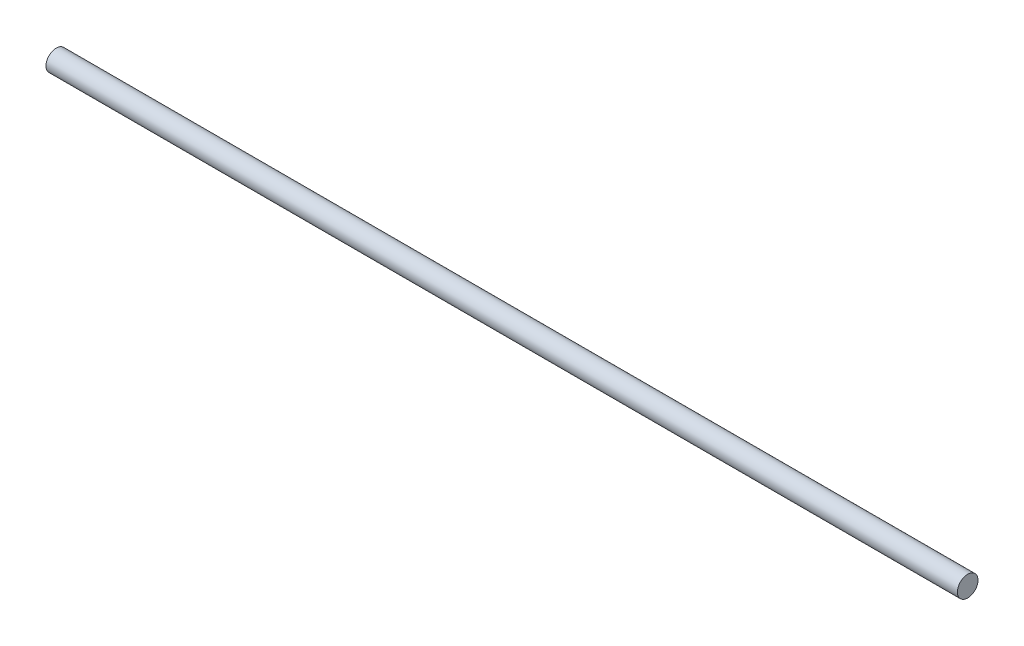
ISO-10303-21;
HEADER;
FILE_DESCRIPTION(('STEP AP214'),'2;1');
FILE_NAME('part.step','',(''),(''),'','','');
FILE_SCHEMA(('AUTOMOTIVE_DESIGN { 1 0 10303 214 1 1 1 1 }'));
ENDSEC;
DATA;
#1=APPLICATION_CONTEXT('core data for automotive mechanical design processes');
#2=APPLICATION_PROTOCOL_DEFINITION('international standard','automotive_design',2000,#1);
#3=PRODUCT_CONTEXT('',#1,'mechanical');
#4=PRODUCT('Part','Part','',(#3));
#5=PRODUCT_RELATED_PRODUCT_CATEGORY('part','',(#4));
#6=PRODUCT_DEFINITION_FORMATION('','',#4);
#7=PRODUCT_DEFINITION_CONTEXT('part definition',#1,'design');
#8=PRODUCT_DEFINITION('design','',#6,#7);
#9=PRODUCT_DEFINITION_SHAPE('','',#8);
#10=(LENGTH_UNIT() NAMED_UNIT(*) SI_UNIT(.MILLI.,.METRE.));
#11=(NAMED_UNIT(*) PLANE_ANGLE_UNIT() SI_UNIT($,.RADIAN.));
#12=(NAMED_UNIT(*) SI_UNIT($,.STERADIAN.) SOLID_ANGLE_UNIT());
#13=UNCERTAINTY_MEASURE_WITH_UNIT(LENGTH_MEASURE(1.E-05),#10,'distance_accuracy_value','');
#14=(GEOMETRIC_REPRESENTATION_CONTEXT(3) GLOBAL_UNCERTAINTY_ASSIGNED_CONTEXT((#13)) GLOBAL_UNIT_ASSIGNED_CONTEXT((#10,
#11,#12)) REPRESENTATION_CONTEXT('',''));
#15=CARTESIAN_POINT('',(0.,0.,0.));
#16=DIRECTION('',(0.,0.,1.));
#17=DIRECTION('',(1.,0.,0.));
#18=AXIS2_PLACEMENT_3D('',#15,#16,#17);
#19=CARTESIAN_POINT('',(280.747487713762,0.,0.));
#20=DIRECTION('',(-1.,0.,0.));
#21=DIRECTION('',(0.,0.,1.));
#22=AXIS2_PLACEMENT_3D('',#19,#20,#21);
#23=CYLINDRICAL_SURFACE('',#22,3.175);
#24=CARTESIAN_POINT('',(280.747487713762,0.,0.));
#25=DIRECTION('',(1.,0.,0.));
#26=DIRECTION('',(0.,0.,-1.));
#27=AXIS2_PLACEMENT_3D('',#24,#25,#26);
#28=CIRCLE('',#27,3.175);
#29=CARTESIAN_POINT('',(280.747487713762,0.,-3.175));
#30=VERTEX_POINT('',#29);
#31=EDGE_CURVE('E10',#30,#30,#28,.T.);
#32=ORIENTED_EDGE('',*,*,#31,.F.);
#33=EDGE_LOOP('',(#32));
#34=FACE_BOUND('',#33,.T.);
#35=CARTESIAN_POINT('',(0.,0.,0.));
#36=DIRECTION('',(1.,0.,0.));
#37=DIRECTION('',(0.,0.,-1.));
#38=AXIS2_PLACEMENT_3D('',#35,#36,#37);
#39=CIRCLE('',#38,3.175);
#40=CARTESIAN_POINT('',(0.,0.,-3.175));
#41=VERTEX_POINT('',#40);
#42=EDGE_CURVE('E44',#41,#41,#39,.T.);
#43=ORIENTED_EDGE('',*,*,#42,.T.);
#44=EDGE_LOOP('',(#43));
#45=FACE_BOUND('',#44,.T.);
#46=ADVANCED_FACE('F45',(#34,#45),#23,.T.);
#47=CARTESIAN_POINT('',(280.747487713762,0.,0.));
#48=DIRECTION('',(1.,0.,0.));
#49=DIRECTION('',(0.,0.,-1.));
#50=AXIS2_PLACEMENT_3D('',#47,#48,#49);
#51=PLANE('',#50);
#52=ORIENTED_EDGE('',*,*,#31,.T.);
#53=EDGE_LOOP('',(#52));
#54=FACE_BOUND('',#53,.T.);
#55=ADVANCED_FACE('F60',(#54),#51,.T.);
#56=CARTESIAN_POINT('',(0.,0.,0.));
#57=DIRECTION('',(1.,0.,0.));
#58=DIRECTION('',(0.,0.,-1.));
#59=AXIS2_PLACEMENT_3D('',#56,#57,#58);
#60=PLANE('',#59);
#61=ORIENTED_EDGE('',*,*,#42,.F.);
#62=EDGE_LOOP('',(#61));
#63=FACE_BOUND('',#62,.T.);
#64=ADVANCED_FACE('F54',(#63),#60,.F.);
#65=CLOSED_SHELL('',(#46,#55,#64));
#66=MANIFOLD_SOLID_BREP('B2',#65);
#67=ADVANCED_BREP_SHAPE_REPRESENTATION('',(#18,#66),#14);
#68=SHAPE_DEFINITION_REPRESENTATION(#9,#67);
ENDSEC;
END-ISO-10303-21;
